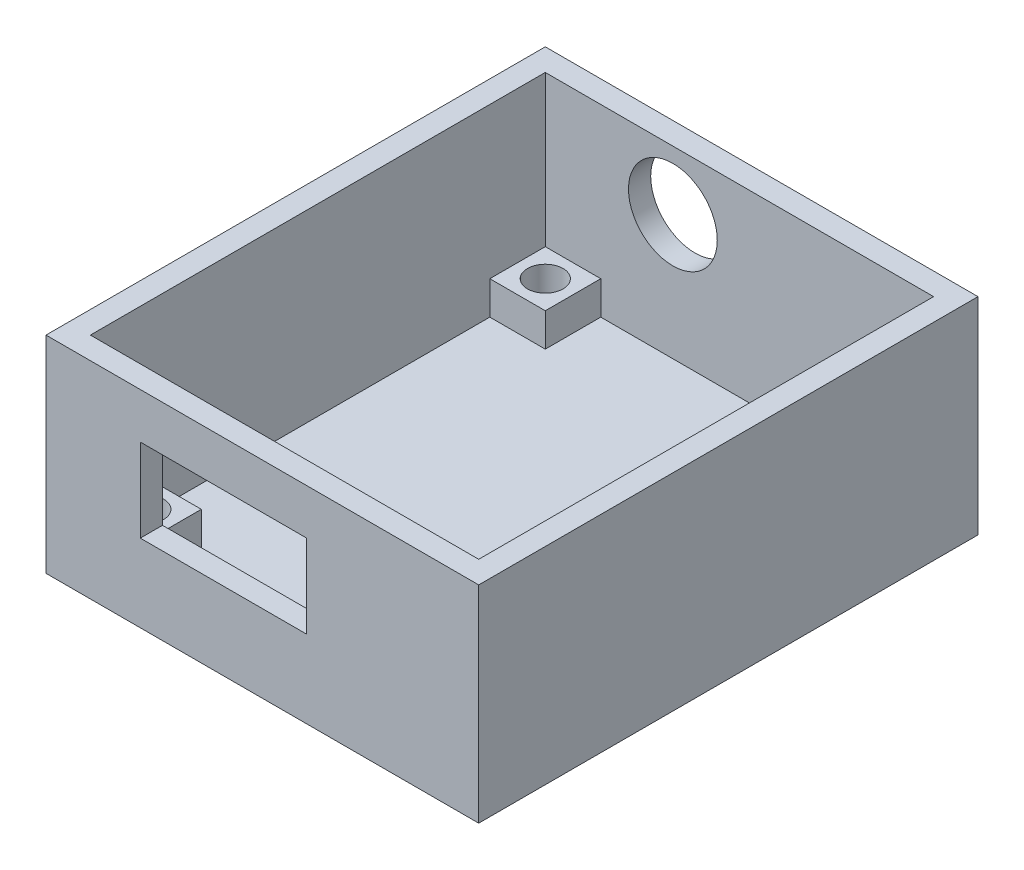
ISO-10303-21;
HEADER;
FILE_DESCRIPTION(('STEP AP214'),'2;1');
FILE_NAME('part.step','',(''),(''),'','','');
FILE_SCHEMA(('AUTOMOTIVE_DESIGN { 1 0 10303 214 1 1 1 1 }'));
ENDSEC;
DATA;
#1=APPLICATION_CONTEXT('core data for automotive mechanical design processes');
#2=APPLICATION_PROTOCOL_DEFINITION('international standard','automotive_design',2000,#1);
#3=PRODUCT_CONTEXT('',#1,'mechanical');
#4=PRODUCT('Part','Part','',(#3));
#5=PRODUCT_RELATED_PRODUCT_CATEGORY('part','',(#4));
#6=PRODUCT_DEFINITION_FORMATION('','',#4);
#7=PRODUCT_DEFINITION_CONTEXT('part definition',#1,'design');
#8=PRODUCT_DEFINITION('design','',#6,#7);
#9=PRODUCT_DEFINITION_SHAPE('','',#8);
#10=(LENGTH_UNIT() NAMED_UNIT(*) SI_UNIT(.MILLI.,.METRE.));
#11=(NAMED_UNIT(*) PLANE_ANGLE_UNIT() SI_UNIT($,.RADIAN.));
#12=(NAMED_UNIT(*) SI_UNIT($,.STERADIAN.) SOLID_ANGLE_UNIT());
#13=UNCERTAINTY_MEASURE_WITH_UNIT(LENGTH_MEASURE(1.E-05),#10,'distance_accuracy_value','');
#14=(GEOMETRIC_REPRESENTATION_CONTEXT(3) GLOBAL_UNCERTAINTY_ASSIGNED_CONTEXT((#13)) GLOBAL_UNIT_ASSIGNED_CONTEXT((#10,
#11,#12)) REPRESENTATION_CONTEXT('',''));
#15=CARTESIAN_POINT('',(0.,0.,0.));
#16=DIRECTION('',(0.,0.,1.));
#17=DIRECTION('',(1.,0.,0.));
#18=AXIS2_PLACEMENT_3D('',#15,#16,#17);
#19=CARTESIAN_POINT('',(0.,2.,0.));
#20=DIRECTION('',(0.,1.,0.));
#21=DIRECTION('',(0.,0.,1.));
#22=AXIS2_PLACEMENT_3D('',#19,#20,#21);
#23=PLANE('',#22);
#24=DIRECTION('',(-1.,0.,0.));
#25=VECTOR('',#24,1.);
#26=CARTESIAN_POINT('',(-17.5,2.,15.5));
#27=LINE('',#26,#25);
#28=CARTESIAN_POINT('',(-12.5,2.,15.5));
#29=VERTEX_POINT('',#28);
#30=CARTESIAN_POINT('',(-17.5,2.,15.5));
#31=VERTEX_POINT('',#30);
#32=EDGE_CURVE('E259',#29,#31,#27,.T.);
#33=ORIENTED_EDGE('',*,*,#32,.F.);
#34=DIRECTION('',(0.,0.,-1.));
#35=VECTOR('',#34,1.);
#36=CARTESIAN_POINT('',(-12.5,2.,20.5));
#37=LINE('',#36,#35);
#38=CARTESIAN_POINT('',(-12.5,2.,20.5));
#39=VERTEX_POINT('',#38);
#40=EDGE_CURVE('E252',#39,#29,#37,.T.);
#41=ORIENTED_EDGE('',*,*,#40,.F.);
#42=DIRECTION('',(1.,0.,0.));
#43=VECTOR('',#42,1.);
#44=CARTESIAN_POINT('',(19.5,2.,20.5));
#45=LINE('',#44,#43);
#46=CARTESIAN_POINT('',(12.4999999999999,2.,20.5));
#47=VERTEX_POINT('',#46);
#48=EDGE_CURVE('E356',#39,#47,#45,.T.);
#49=ORIENTED_EDGE('',*,*,#48,.T.);
#50=DIRECTION('',(0.,0.,1.));
#51=VECTOR('',#50,1.);
#52=CARTESIAN_POINT('',(12.4999999999999,2.,20.5));
#53=LINE('',#52,#51);
#54=CARTESIAN_POINT('',(12.4999999999999,2.,15.5));
#55=VERTEX_POINT('',#54);
#56=EDGE_CURVE('E284',#55,#47,#53,.T.);
#57=ORIENTED_EDGE('',*,*,#56,.F.);
#58=DIRECTION('',(-1.,0.,0.));
#59=VECTOR('',#58,1.);
#60=CARTESIAN_POINT('',(17.4999999999999,2.,15.5));
#61=LINE('',#60,#59);
#62=CARTESIAN_POINT('',(17.5,2.,15.5));
#63=VERTEX_POINT('',#62);
#64=EDGE_CURVE('E279',#63,#55,#61,.T.);
#65=ORIENTED_EDGE('',*,*,#64,.F.);
#66=DIRECTION('',(0.,0.,-1.));
#67=VECTOR('',#66,1.);
#68=CARTESIAN_POINT('',(17.5,2.,22.5));
#69=LINE('',#68,#67);
#70=CARTESIAN_POINT('',(17.5,2.,-15.5));
#71=VERTEX_POINT('',#70);
#72=EDGE_CURVE('E367',#63,#71,#69,.T.);
#73=ORIENTED_EDGE('',*,*,#72,.T.);
#74=DIRECTION('',(1.,0.,0.));
#75=VECTOR('',#74,1.);
#76=CARTESIAN_POINT('',(17.4999999999999,2.,-15.5));
#77=LINE('',#76,#75);
#78=CARTESIAN_POINT('',(12.4999999999999,2.,-15.5));
#79=VERTEX_POINT('',#78);
#80=EDGE_CURVE('E310',#79,#71,#77,.T.);
#81=ORIENTED_EDGE('',*,*,#80,.F.);
#82=DIRECTION('',(0.,0.,1.));
#83=VECTOR('',#82,1.);
#84=CARTESIAN_POINT('',(12.4999999999999,2.,-20.5));
#85=LINE('',#84,#83);
#86=CARTESIAN_POINT('',(12.4999999999999,2.,-20.5));
#87=VERTEX_POINT('',#86);
#88=EDGE_CURVE('E305',#87,#79,#85,.T.);
#89=ORIENTED_EDGE('',*,*,#88,.F.);
#90=DIRECTION('',(-1.,0.,0.));
#91=VECTOR('',#90,1.);
#92=CARTESIAN_POINT('',(19.5,2.,-20.5));
#93=LINE('',#92,#91);
#94=CARTESIAN_POINT('',(-12.5,2.,-20.5));
#95=VERTEX_POINT('',#94);
#96=EDGE_CURVE('E370',#87,#95,#93,.T.);
#97=ORIENTED_EDGE('',*,*,#96,.T.);
#98=DIRECTION('',(0.,0.,-1.));
#99=VECTOR('',#98,1.);
#100=CARTESIAN_POINT('',(-12.5,2.,-20.5));
#101=LINE('',#100,#99);
#102=CARTESIAN_POINT('',(-12.5,2.,-15.5));
#103=VERTEX_POINT('',#102);
#104=EDGE_CURVE('E336',#103,#95,#101,.T.);
#105=ORIENTED_EDGE('',*,*,#104,.F.);
#106=DIRECTION('',(1.,0.,0.));
#107=VECTOR('',#106,1.);
#108=CARTESIAN_POINT('',(-17.5,2.,-15.5));
#109=LINE('',#108,#107);
#110=CARTESIAN_POINT('',(-17.5,2.,-15.5));
#111=VERTEX_POINT('',#110);
#112=EDGE_CURVE('E331',#111,#103,#109,.T.);
#113=ORIENTED_EDGE('',*,*,#112,.F.);
#114=DIRECTION('',(0.,0.,1.));
#115=VECTOR('',#114,1.);
#116=CARTESIAN_POINT('',(-17.5,2.,22.5));
#117=LINE('',#116,#115);
#118=EDGE_CURVE('E353',#111,#31,#117,.T.);
#119=ORIENTED_EDGE('',*,*,#118,.T.);
#120=EDGE_LOOP('',(#33,#41,#49,#57,#65,#73,#81,#89,#97,#105,#113,#119));
#121=FACE_BOUND('',#120,.T.);
#122=ADVANCED_FACE('F32',(#121),#23,.T.);
#123=CARTESIAN_POINT('',(19.5,18.6,20.5));
#124=DIRECTION('',(0.,0.,-1.));
#125=DIRECTION('',(-1.,0.,0.));
#126=AXIS2_PLACEMENT_3D('',#123,#124,#125);
#127=PLANE('',#126);
#128=DIRECTION('',(0.,1.,0.));
#129=VECTOR('',#128,1.);
#130=CARTESIAN_POINT('',(4.,14.5,20.5));
#131=LINE('',#130,#129);
#132=CARTESIAN_POINT('',(4.00000000000001,7.,20.5));
#133=VERTEX_POINT('',#132);
#134=CARTESIAN_POINT('',(4.,14.5,20.5));
#135=VERTEX_POINT('',#134);
#136=EDGE_CURVE('E196',#133,#135,#131,.T.);
#137=ORIENTED_EDGE('',*,*,#136,.T.);
#138=DIRECTION('',(-1.,0.,0.));
#139=VECTOR('',#138,1.);
#140=CARTESIAN_POINT('',(-11.,14.5,20.5));
#141=LINE('',#140,#139);
#142=CARTESIAN_POINT('',(-11.,14.5,20.5));
#143=VERTEX_POINT('',#142);
#144=EDGE_CURVE('E219',#135,#143,#141,.T.);
#145=ORIENTED_EDGE('',*,*,#144,.T.);
#146=DIRECTION('',(0.,-1.,0.));
#147=VECTOR('',#146,1.);
#148=CARTESIAN_POINT('',(-11.,14.5,20.5));
#149=LINE('',#148,#147);
#150=CARTESIAN_POINT('',(-11.,7.,20.5));
#151=VERTEX_POINT('',#150);
#152=EDGE_CURVE('E199',#143,#151,#149,.T.);
#153=ORIENTED_EDGE('',*,*,#152,.T.);
#154=DIRECTION('',(1.,0.,0.));
#155=VECTOR('',#154,1.);
#156=CARTESIAN_POINT('',(-11.,7.,20.5));
#157=LINE('',#156,#155);
#158=EDGE_CURVE('E200',#151,#133,#157,.T.);
#159=ORIENTED_EDGE('',*,*,#158,.T.);
#160=EDGE_LOOP('',(#137,#145,#153,#159));
#161=FACE_BOUND('',#160,.T.);
#162=ORIENTED_EDGE('',*,*,#48,.F.);
#163=DIRECTION('',(0.,-1.,0.));
#164=VECTOR('',#163,1.);
#165=CARTESIAN_POINT('',(-12.5,5.,20.5));
#166=LINE('',#165,#164);
#167=CARTESIAN_POINT('',(-12.5,5.,20.5));
#168=VERTEX_POINT('',#167);
#169=EDGE_CURVE('E276',#168,#39,#166,.T.);
#170=ORIENTED_EDGE('',*,*,#169,.F.);
#171=DIRECTION('',(1.,0.,0.));
#172=VECTOR('',#171,1.);
#173=CARTESIAN_POINT('',(-17.5,5.,20.5));
#174=LINE('',#173,#172);
#175=CARTESIAN_POINT('',(-17.5,5.,20.5));
#176=VERTEX_POINT('',#175);
#177=EDGE_CURVE('E255',#176,#168,#174,.T.);
#178=ORIENTED_EDGE('',*,*,#177,.F.);
#179=DIRECTION('',(0.,-1.,0.));
#180=VECTOR('',#179,1.);
#181=CARTESIAN_POINT('',(-17.5,18.6,20.5));
#182=LINE('',#181,#180);
#183=CARTESIAN_POINT('',(-17.5,18.6,20.5));
#184=VERTEX_POINT('',#183);
#185=EDGE_CURVE('E357',#184,#176,#182,.T.);
#186=ORIENTED_EDGE('',*,*,#185,.F.);
#187=DIRECTION('',(1.,0.,0.));
#188=VECTOR('',#187,1.);
#189=CARTESIAN_POINT('',(19.5,18.6,20.5));
#190=LINE('',#189,#188);
#191=CARTESIAN_POINT('',(17.5,18.6,20.5));
#192=VERTEX_POINT('',#191);
#193=EDGE_CURVE('E375',#184,#192,#190,.T.);
#194=ORIENTED_EDGE('',*,*,#193,.T.);
#195=DIRECTION('',(0.,-1.,0.));
#196=VECTOR('',#195,1.);
#197=CARTESIAN_POINT('',(17.5,18.6,20.5));
#198=LINE('',#197,#196);
#199=CARTESIAN_POINT('',(17.4999999999999,5.,20.5));
#200=VERTEX_POINT('',#199);
#201=EDGE_CURVE('E360',#192,#200,#198,.T.);
#202=ORIENTED_EDGE('',*,*,#201,.T.);
#203=DIRECTION('',(1.,0.,0.));
#204=VECTOR('',#203,1.);
#205=CARTESIAN_POINT('',(17.4999999999999,5.,20.5));
#206=LINE('',#205,#204);
#207=CARTESIAN_POINT('',(12.4999999999999,5.,20.5));
#208=VERTEX_POINT('',#207);
#209=EDGE_CURVE('E289',#208,#200,#206,.T.);
#210=ORIENTED_EDGE('',*,*,#209,.F.);
#211=DIRECTION('',(0.,-1.,0.));
#212=VECTOR('',#211,1.);
#213=CARTESIAN_POINT('',(12.4999999999999,5.,20.5));
#214=LINE('',#213,#212);
#215=EDGE_CURVE('E292',#208,#47,#214,.T.);
#216=ORIENTED_EDGE('',*,*,#215,.T.);
#217=EDGE_LOOP('',(#162,#170,#178,#186,#194,#202,#210,#216));
#218=FACE_BOUND('',#217,.T.);
#219=ADVANCED_FACE('F431',(#161,#218),#127,.T.);
#220=CARTESIAN_POINT('',(-17.5,18.6,22.5));
#221=DIRECTION('',(1.,0.,0.));
#222=DIRECTION('',(0.,0.,-1.));
#223=AXIS2_PLACEMENT_3D('',#220,#221,#222);
#224=PLANE('',#223);
#225=DIRECTION('',(0.,0.,1.));
#226=VECTOR('',#225,1.);
#227=CARTESIAN_POINT('',(-17.5,5.,20.5));
#228=LINE('',#227,#226);
#229=CARTESIAN_POINT('',(-17.5,5.,15.5));
#230=VERTEX_POINT('',#229);
#231=EDGE_CURVE('E264',#230,#176,#228,.T.);
#232=ORIENTED_EDGE('',*,*,#231,.F.);
#233=DIRECTION('',(0.,-1.,0.));
#234=VECTOR('',#233,1.);
#235=CARTESIAN_POINT('',(-17.5,5.,15.5));
#236=LINE('',#235,#234);
#237=EDGE_CURVE('E267',#230,#31,#236,.T.);
#238=ORIENTED_EDGE('',*,*,#237,.T.);
#239=ORIENTED_EDGE('',*,*,#118,.F.);
#240=DIRECTION('',(0.,-1.,0.));
#241=VECTOR('',#240,1.);
#242=CARTESIAN_POINT('',(-17.5,5.,-15.5));
#243=LINE('',#242,#241);
#244=CARTESIAN_POINT('',(-17.5,5.,-15.5));
#245=VERTEX_POINT('',#244);
#246=EDGE_CURVE('E351',#245,#111,#243,.T.);
#247=ORIENTED_EDGE('',*,*,#246,.F.);
#248=DIRECTION('',(0.,0.,1.));
#249=VECTOR('',#248,1.);
#250=CARTESIAN_POINT('',(-17.5,5.,-20.5));
#251=LINE('',#250,#249);
#252=CARTESIAN_POINT('',(-17.5,5.,-20.5));
#253=VERTEX_POINT('',#252);
#254=EDGE_CURVE('E332',#253,#245,#251,.T.);
#255=ORIENTED_EDGE('',*,*,#254,.F.);
#256=DIRECTION('',(0.,-1.,0.));
#257=VECTOR('',#256,1.);
#258=CARTESIAN_POINT('',(-17.5,18.6,-20.5));
#259=LINE('',#258,#257);
#260=CARTESIAN_POINT('',(-17.5,18.6,-20.5));
#261=VERTEX_POINT('',#260);
#262=EDGE_CURVE('E361',#261,#253,#259,.T.);
#263=ORIENTED_EDGE('',*,*,#262,.F.);
#264=DIRECTION('',(0.,0.,1.));
#265=VECTOR('',#264,1.);
#266=CARTESIAN_POINT('',(-17.5,18.6,22.5));
#267=LINE('',#266,#265);
#268=EDGE_CURVE('E373',#261,#184,#267,.T.);
#269=ORIENTED_EDGE('',*,*,#268,.T.);
#270=ORIENTED_EDGE('',*,*,#185,.T.);
#271=EDGE_LOOP('',(#232,#238,#239,#247,#255,#263,#269,#270));
#272=FACE_BOUND('',#271,.T.);
#273=ADVANCED_FACE('F437',(#272),#224,.T.);
#274=CARTESIAN_POINT('',(17.5,18.6,22.5));
#275=DIRECTION('',(-1.,0.,0.));
#276=DIRECTION('',(0.,0.,1.));
#277=AXIS2_PLACEMENT_3D('',#274,#275,#276);
#278=PLANE('',#277);
#279=ORIENTED_EDGE('',*,*,#72,.F.);
#280=DIRECTION('',(0.,-1.,0.));
#281=VECTOR('',#280,1.);
#282=CARTESIAN_POINT('',(17.4999999999999,5.,15.5));
#283=LINE('',#282,#281);
#284=CARTESIAN_POINT('',(17.5,5.,15.5));
#285=VERTEX_POINT('',#284);
#286=EDGE_CURVE('E302',#285,#63,#283,.T.);
#287=ORIENTED_EDGE('',*,*,#286,.F.);
#288=DIRECTION('',(0.,0.,-1.));
#289=VECTOR('',#288,1.);
#290=CARTESIAN_POINT('',(17.4999999999999,5.,20.5));
#291=LINE('',#290,#289);
#292=EDGE_CURVE('E280',#200,#285,#291,.T.);
#293=ORIENTED_EDGE('',*,*,#292,.F.);
#294=ORIENTED_EDGE('',*,*,#201,.F.);
#295=DIRECTION('',(0.,0.,-1.));
#296=VECTOR('',#295,1.);
#297=CARTESIAN_POINT('',(17.5,18.6,22.5));
#298=LINE('',#297,#296);
#299=CARTESIAN_POINT('',(17.5,18.6,-20.5));
#300=VERTEX_POINT('',#299);
#301=EDGE_CURVE('E377',#192,#300,#298,.T.);
#302=ORIENTED_EDGE('',*,*,#301,.T.);
#303=DIRECTION('',(0.,-1.,0.));
#304=VECTOR('',#303,1.);
#305=CARTESIAN_POINT('',(17.5,18.6,-20.5));
#306=LINE('',#305,#304);
#307=CARTESIAN_POINT('',(17.4999999999999,5.,-20.5));
#308=VERTEX_POINT('',#307);
#309=EDGE_CURVE('E364',#300,#308,#306,.T.);
#310=ORIENTED_EDGE('',*,*,#309,.T.);
#311=DIRECTION('',(0.,0.,-1.));
#312=VECTOR('',#311,1.);
#313=CARTESIAN_POINT('',(17.4999999999999,5.,-20.5));
#314=LINE('',#313,#312);
#315=CARTESIAN_POINT('',(17.5,5.,-15.5));
#316=VERTEX_POINT('',#315);
#317=EDGE_CURVE('E315',#316,#308,#314,.T.);
#318=ORIENTED_EDGE('',*,*,#317,.F.);
#319=DIRECTION('',(0.,-1.,0.));
#320=VECTOR('',#319,1.);
#321=CARTESIAN_POINT('',(17.4999999999999,5.,-15.5));
#322=LINE('',#321,#320);
#323=EDGE_CURVE('E318',#316,#71,#322,.T.);
#324=ORIENTED_EDGE('',*,*,#323,.T.);
#325=EDGE_LOOP('',(#279,#287,#293,#294,#302,#310,#318,#324));
#326=FACE_BOUND('',#325,.T.);
#327=ADVANCED_FACE('F485',(#326),#278,.T.);
#328=CARTESIAN_POINT('',(19.5,18.6,-20.5));
#329=DIRECTION('',(0.,0.,1.));
#330=DIRECTION('',(1.,0.,0.));
#331=AXIS2_PLACEMENT_3D('',#328,#329,#330);
#332=PLANE('',#331);
#333=CARTESIAN_POINT('',(-6.,13.25,-20.5));
#334=DIRECTION('',(0.,0.,1.));
#335=DIRECTION('',(1.,0.,0.));
#336=AXIS2_PLACEMENT_3D('',#333,#334,#335);
#337=CIRCLE('',#336,4.);
#338=CARTESIAN_POINT('',(-2.,13.25,-20.5));
#339=VERTEX_POINT('',#338);
#340=EDGE_CURVE('E456',#339,#339,#337,.F.);
#341=ORIENTED_EDGE('',*,*,#340,.T.);
#342=EDGE_LOOP('',(#341));
#343=FACE_BOUND('',#342,.T.);
#344=ORIENTED_EDGE('',*,*,#96,.F.);
#345=DIRECTION('',(0.,-1.,0.));
#346=VECTOR('',#345,1.);
#347=CARTESIAN_POINT('',(12.4999999999999,5.,-20.5));
#348=LINE('',#347,#346);
#349=CARTESIAN_POINT('',(12.4999999999999,5.,-20.5));
#350=VERTEX_POINT('',#349);
#351=EDGE_CURVE('E328',#350,#87,#348,.T.);
#352=ORIENTED_EDGE('',*,*,#351,.F.);
#353=DIRECTION('',(-1.,0.,0.));
#354=VECTOR('',#353,1.);
#355=CARTESIAN_POINT('',(17.4999999999999,5.,-20.5));
#356=LINE('',#355,#354);
#357=EDGE_CURVE('E306',#308,#350,#356,.T.);
#358=ORIENTED_EDGE('',*,*,#357,.F.);
#359=ORIENTED_EDGE('',*,*,#309,.F.);
#360=DIRECTION('',(-1.,0.,0.));
#361=VECTOR('',#360,1.);
#362=CARTESIAN_POINT('',(19.5,18.6,-20.5));
#363=LINE('',#362,#361);
#364=EDGE_CURVE('E365',#300,#261,#363,.T.);
#365=ORIENTED_EDGE('',*,*,#364,.T.);
#366=ORIENTED_EDGE('',*,*,#262,.T.);
#367=DIRECTION('',(-1.,0.,0.));
#368=VECTOR('',#367,1.);
#369=CARTESIAN_POINT('',(-17.5,5.,-20.5));
#370=LINE('',#369,#368);
#371=CARTESIAN_POINT('',(-12.5,5.,-20.5));
#372=VERTEX_POINT('',#371);
#373=EDGE_CURVE('E340',#372,#253,#370,.T.);
#374=ORIENTED_EDGE('',*,*,#373,.F.);
#375=DIRECTION('',(0.,-1.,0.));
#376=VECTOR('',#375,1.);
#377=CARTESIAN_POINT('',(-12.5,5.,-20.5));
#378=LINE('',#377,#376);
#379=EDGE_CURVE('E342',#372,#95,#378,.T.);
#380=ORIENTED_EDGE('',*,*,#379,.T.);
#381=EDGE_LOOP('',(#344,#352,#358,#359,#365,#366,#374,#380));
#382=FACE_BOUND('',#381,.T.);
#383=ADVANCED_FACE('F429',(#343,#382),#332,.T.);
#384=CARTESIAN_POINT('',(-19.5,18.6,22.5));
#385=DIRECTION('',(1.,0.,0.));
#386=DIRECTION('',(0.,0.,-1.));
#387=AXIS2_PLACEMENT_3D('',#384,#385,#386);
#388=PLANE('',#387);
#389=DIRECTION('',(0.,0.,1.));
#390=VECTOR('',#389,1.);
#391=CARTESIAN_POINT('',(-19.5,0.,22.5));
#392=LINE('',#391,#390);
#393=CARTESIAN_POINT('',(-19.5,0.,-22.5));
#394=VERTEX_POINT('',#393);
#395=CARTESIAN_POINT('',(-19.5,0.,22.5));
#396=VERTEX_POINT('',#395);
#397=EDGE_CURVE('E359',#394,#396,#392,.T.);
#398=ORIENTED_EDGE('',*,*,#397,.T.);
#399=DIRECTION('',(0.,-1.,0.));
#400=VECTOR('',#399,1.);
#401=CARTESIAN_POINT('',(-19.5,18.6,22.5));
#402=LINE('',#401,#400);
#403=CARTESIAN_POINT('',(-19.5,18.6,22.5));
#404=VERTEX_POINT('',#403);
#405=EDGE_CURVE('E11',#404,#396,#402,.T.);
#406=ORIENTED_EDGE('',*,*,#405,.F.);
#407=DIRECTION('',(0.,0.,1.));
#408=VECTOR('',#407,1.);
#409=CARTESIAN_POINT('',(-19.5,18.6,22.5));
#410=LINE('',#409,#408);
#411=CARTESIAN_POINT('',(-19.5,18.6,-22.5));
#412=VERTEX_POINT('',#411);
#413=EDGE_CURVE('E381',#412,#404,#410,.T.);
#414=ORIENTED_EDGE('',*,*,#413,.F.);
#415=DIRECTION('',(0.,-1.,0.));
#416=VECTOR('',#415,1.);
#417=CARTESIAN_POINT('',(-19.5,18.6,-22.5));
#418=LINE('',#417,#416);
#419=EDGE_CURVE('E391',#412,#394,#418,.T.);
#420=ORIENTED_EDGE('',*,*,#419,.T.);
#421=EDGE_LOOP('',(#398,#406,#414,#420));
#422=FACE_BOUND('',#421,.T.);
#423=ADVANCED_FACE('F34',(#422),#388,.F.);
#424=CARTESIAN_POINT('',(19.5,18.6,22.5));
#425=DIRECTION('',(0.,0.,-1.));
#426=DIRECTION('',(-1.,0.,0.));
#427=AXIS2_PLACEMENT_3D('',#424,#425,#426);
#428=PLANE('',#427);
#429=DIRECTION('',(-1.,0.,0.));
#430=VECTOR('',#429,1.);
#431=CARTESIAN_POINT('',(-11.,14.5,22.5));
#432=LINE('',#431,#430);
#433=CARTESIAN_POINT('',(4.,14.5,22.5));
#434=VERTEX_POINT('',#433);
#435=CARTESIAN_POINT('',(-11.,14.5,22.5));
#436=VERTEX_POINT('',#435);
#437=EDGE_CURVE('E216',#434,#436,#432,.T.);
#438=ORIENTED_EDGE('',*,*,#437,.F.);
#439=DIRECTION('',(0.,1.,0.));
#440=VECTOR('',#439,1.);
#441=CARTESIAN_POINT('',(4.,14.5,22.5));
#442=LINE('',#441,#440);
#443=CARTESIAN_POINT('',(4.00000000000001,7.,22.5));
#444=VERTEX_POINT('',#443);
#445=EDGE_CURVE('E55',#444,#434,#442,.T.);
#446=ORIENTED_EDGE('',*,*,#445,.F.);
#447=DIRECTION('',(1.,0.,0.));
#448=VECTOR('',#447,1.);
#449=CARTESIAN_POINT('',(-11.,7.,22.5));
#450=LINE('',#449,#448);
#451=CARTESIAN_POINT('',(-11.,7.,22.5));
#452=VERTEX_POINT('',#451);
#453=EDGE_CURVE('E203',#452,#444,#450,.T.);
#454=ORIENTED_EDGE('',*,*,#453,.F.);
#455=DIRECTION('',(0.,-1.,0.));
#456=VECTOR('',#455,1.);
#457=CARTESIAN_POINT('',(-11.,14.5,22.5));
#458=LINE('',#457,#456);
#459=EDGE_CURVE('E211',#436,#452,#458,.T.);
#460=ORIENTED_EDGE('',*,*,#459,.F.);
#461=EDGE_LOOP('',(#438,#446,#454,#460));
#462=FACE_BOUND('',#461,.T.);
#463=DIRECTION('',(1.,0.,0.));
#464=VECTOR('',#463,1.);
#465=CARTESIAN_POINT('',(19.5,0.,22.5));
#466=LINE('',#465,#464);
#467=CARTESIAN_POINT('',(19.5,0.,22.5));
#468=VERTEX_POINT('',#467);
#469=EDGE_CURVE('E394',#396,#468,#466,.T.);
#470=ORIENTED_EDGE('',*,*,#469,.T.);
#471=DIRECTION('',(0.,-1.,0.));
#472=VECTOR('',#471,1.);
#473=CARTESIAN_POINT('',(19.5,18.6,22.5));
#474=LINE('',#473,#472);
#475=CARTESIAN_POINT('',(19.5,18.6,22.5));
#476=VERTEX_POINT('',#475);
#477=EDGE_CURVE('E40',#476,#468,#474,.T.);
#478=ORIENTED_EDGE('',*,*,#477,.F.);
#479=DIRECTION('',(1.,0.,0.));
#480=VECTOR('',#479,1.);
#481=CARTESIAN_POINT('',(19.5,18.6,22.5));
#482=LINE('',#481,#480);
#483=EDGE_CURVE('E384',#404,#476,#482,.T.);
#484=ORIENTED_EDGE('',*,*,#483,.F.);
#485=ORIENTED_EDGE('',*,*,#405,.T.);
#486=EDGE_LOOP('',(#470,#478,#484,#485));
#487=FACE_BOUND('',#486,.T.);
#488=ADVANCED_FACE('F214',(#462,#487),#428,.F.);
#489=CARTESIAN_POINT('',(19.5,18.6,22.5));
#490=DIRECTION('',(-1.,0.,0.));
#491=DIRECTION('',(0.,0.,1.));
#492=AXIS2_PLACEMENT_3D('',#489,#490,#491);
#493=PLANE('',#492);
#494=DIRECTION('',(0.,0.,-1.));
#495=VECTOR('',#494,1.);
#496=CARTESIAN_POINT('',(19.5,0.,22.5));
#497=LINE('',#496,#495);
#498=CARTESIAN_POINT('',(19.5,0.,-22.5));
#499=VERTEX_POINT('',#498);
#500=EDGE_CURVE('E396',#468,#499,#497,.T.);
#501=ORIENTED_EDGE('',*,*,#500,.T.);
#502=DIRECTION('',(0.,-1.,0.));
#503=VECTOR('',#502,1.);
#504=CARTESIAN_POINT('',(19.5,18.6,-22.5));
#505=LINE('',#504,#503);
#506=CARTESIAN_POINT('',(19.5,18.6,-22.5));
#507=VERTEX_POINT('',#506);
#508=EDGE_CURVE('E401',#507,#499,#505,.T.);
#509=ORIENTED_EDGE('',*,*,#508,.F.);
#510=DIRECTION('',(0.,0.,-1.));
#511=VECTOR('',#510,1.);
#512=CARTESIAN_POINT('',(19.5,18.6,22.5));
#513=LINE('',#512,#511);
#514=EDGE_CURVE('E387',#476,#507,#513,.T.);
#515=ORIENTED_EDGE('',*,*,#514,.F.);
#516=ORIENTED_EDGE('',*,*,#477,.T.);
#517=EDGE_LOOP('',(#501,#509,#515,#516));
#518=FACE_BOUND('',#517,.T.);
#519=ADVANCED_FACE('F408',(#518),#493,.F.);
#520=CARTESIAN_POINT('',(19.5,18.6,-22.5));
#521=DIRECTION('',(0.,0.,1.));
#522=DIRECTION('',(1.,0.,0.));
#523=AXIS2_PLACEMENT_3D('',#520,#521,#522);
#524=PLANE('',#523);
#525=CARTESIAN_POINT('',(-6.,13.25,-22.5));
#526=DIRECTION('',(0.,0.,-1.));
#527=DIRECTION('',(-1.,0.,0.));
#528=AXIS2_PLACEMENT_3D('',#525,#526,#527);
#529=CIRCLE('',#528,4.);
#530=CARTESIAN_POINT('',(-10.,13.25,-22.5));
#531=VERTEX_POINT('',#530);
#532=EDGE_CURVE('E225',#531,#531,#529,.T.);
#533=ORIENTED_EDGE('',*,*,#532,.F.);
#534=EDGE_LOOP('',(#533));
#535=FACE_BOUND('',#534,.T.);
#536=DIRECTION('',(-1.,0.,0.));
#537=VECTOR('',#536,1.);
#538=CARTESIAN_POINT('',(19.5,0.,-22.5));
#539=LINE('',#538,#537);
#540=EDGE_CURVE('E385',#499,#394,#539,.T.);
#541=ORIENTED_EDGE('',*,*,#540,.T.);
#542=ORIENTED_EDGE('',*,*,#419,.F.);
#543=DIRECTION('',(-1.,0.,0.));
#544=VECTOR('',#543,1.);
#545=CARTESIAN_POINT('',(19.5,18.6,-22.5));
#546=LINE('',#545,#544);
#547=EDGE_CURVE('E389',#507,#412,#546,.T.);
#548=ORIENTED_EDGE('',*,*,#547,.F.);
#549=ORIENTED_EDGE('',*,*,#508,.T.);
#550=EDGE_LOOP('',(#541,#542,#548,#549));
#551=FACE_BOUND('',#550,.T.);
#552=ADVANCED_FACE('F416',(#535,#551),#524,.F.);
#553=CARTESIAN_POINT('',(0.,18.6,0.));
#554=DIRECTION('',(0.,1.,0.));
#555=DIRECTION('',(0.,0.,1.));
#556=AXIS2_PLACEMENT_3D('',#553,#554,#555);
#557=PLANE('',#556);
#558=ORIENTED_EDGE('',*,*,#268,.F.);
#559=ORIENTED_EDGE('',*,*,#364,.F.);
#560=ORIENTED_EDGE('',*,*,#301,.F.);
#561=ORIENTED_EDGE('',*,*,#193,.F.);
#562=EDGE_LOOP('',(#558,#559,#560,#561));
#563=FACE_BOUND('',#562,.T.);
#564=ORIENTED_EDGE('',*,*,#413,.T.);
#565=ORIENTED_EDGE('',*,*,#483,.T.);
#566=ORIENTED_EDGE('',*,*,#514,.T.);
#567=ORIENTED_EDGE('',*,*,#547,.T.);
#568=EDGE_LOOP('',(#564,#565,#566,#567));
#569=FACE_BOUND('',#568,.T.);
#570=ADVANCED_FACE('F422',(#563,#569),#557,.T.);
#571=CARTESIAN_POINT('',(0.,0.,0.));
#572=DIRECTION('',(0.,1.,0.));
#573=DIRECTION('',(0.,0.,1.));
#574=AXIS2_PLACEMENT_3D('',#571,#572,#573);
#575=PLANE('',#574);
#576=ORIENTED_EDGE('',*,*,#397,.F.);
#577=ORIENTED_EDGE('',*,*,#540,.F.);
#578=ORIENTED_EDGE('',*,*,#500,.F.);
#579=ORIENTED_EDGE('',*,*,#469,.F.);
#580=EDGE_LOOP('',(#576,#577,#578,#579));
#581=FACE_BOUND('',#580,.T.);
#582=ADVANCED_FACE('F413',(#581),#575,.F.);
#583=CARTESIAN_POINT('',(-17.5,5.,-15.5));
#584=DIRECTION('',(0.,0.,-1.));
#585=DIRECTION('',(-1.,0.,0.));
#586=AXIS2_PLACEMENT_3D('',#583,#584,#585);
#587=PLANE('',#586);
#588=ORIENTED_EDGE('',*,*,#112,.T.);
#589=DIRECTION('',(0.,-1.,0.));
#590=VECTOR('',#589,1.);
#591=CARTESIAN_POINT('',(-12.5,5.,-15.5));
#592=LINE('',#591,#590);
#593=CARTESIAN_POINT('',(-12.5,5.,-15.5));
#594=VERTEX_POINT('',#593);
#595=EDGE_CURVE('E349',#594,#103,#592,.T.);
#596=ORIENTED_EDGE('',*,*,#595,.F.);
#597=DIRECTION('',(1.,0.,0.));
#598=VECTOR('',#597,1.);
#599=CARTESIAN_POINT('',(-17.5,5.,-15.5));
#600=LINE('',#599,#598);
#601=EDGE_CURVE('E335',#245,#594,#600,.T.);
#602=ORIENTED_EDGE('',*,*,#601,.F.);
#603=ORIENTED_EDGE('',*,*,#246,.T.);
#604=EDGE_LOOP('',(#588,#596,#602,#603));
#605=FACE_BOUND('',#604,.T.);
#606=ADVANCED_FACE('F448',(#605),#587,.F.);
#607=CARTESIAN_POINT('',(-12.5,5.,-20.5));
#608=DIRECTION('',(-1.,0.,0.));
#609=DIRECTION('',(0.,0.,1.));
#610=AXIS2_PLACEMENT_3D('',#607,#608,#609);
#611=PLANE('',#610);
#612=ORIENTED_EDGE('',*,*,#104,.T.);
#613=ORIENTED_EDGE('',*,*,#379,.F.);
#614=DIRECTION('',(0.,0.,-1.));
#615=VECTOR('',#614,1.);
#616=CARTESIAN_POINT('',(-12.5,5.,-20.5));
#617=LINE('',#616,#615);
#618=EDGE_CURVE('E338',#594,#372,#617,.T.);
#619=ORIENTED_EDGE('',*,*,#618,.F.);
#620=ORIENTED_EDGE('',*,*,#595,.T.);
#621=EDGE_LOOP('',(#612,#613,#619,#620));
#622=FACE_BOUND('',#621,.T.);
#623=ADVANCED_FACE('F514',(#622),#611,.F.);
#624=CARTESIAN_POINT('',(0.,5.,0.));
#625=DIRECTION('',(0.,1.,0.));
#626=DIRECTION('',(0.,0.,1.));
#627=AXIS2_PLACEMENT_3D('',#624,#625,#626);
#628=PLANE('',#627);
#629=CARTESIAN_POINT('',(-15.,5.,-18.));
#630=DIRECTION('',(0.,1.,0.));
#631=DIRECTION('',(0.,0.,1.));
#632=AXIS2_PLACEMENT_3D('',#629,#630,#631);
#633=CIRCLE('',#632,1.6);
#634=CARTESIAN_POINT('',(-15.,5.,-16.4));
#635=VERTEX_POINT('',#634);
#636=EDGE_CURVE('E234',#635,#635,#633,.T.);
#637=ORIENTED_EDGE('',*,*,#636,.F.);
#638=EDGE_LOOP('',(#637));
#639=FACE_BOUND('',#638,.T.);
#640=ORIENTED_EDGE('',*,*,#254,.T.);
#641=ORIENTED_EDGE('',*,*,#601,.T.);
#642=ORIENTED_EDGE('',*,*,#618,.T.);
#643=ORIENTED_EDGE('',*,*,#373,.T.);
#644=EDGE_LOOP('',(#640,#641,#642,#643));
#645=FACE_BOUND('',#644,.T.);
#646=ADVANCED_FACE('F550',(#639,#645),#628,.T.);
#647=CARTESIAN_POINT('',(12.4999999999999,5.,-20.5));
#648=DIRECTION('',(1.,0.,0.));
#649=DIRECTION('',(0.,0.,-1.));
#650=AXIS2_PLACEMENT_3D('',#647,#648,#649);
#651=PLANE('',#650);
#652=ORIENTED_EDGE('',*,*,#88,.T.);
#653=DIRECTION('',(0.,-1.,0.));
#654=VECTOR('',#653,1.);
#655=CARTESIAN_POINT('',(12.4999999999999,5.,-15.5));
#656=LINE('',#655,#654);
#657=CARTESIAN_POINT('',(12.4999999999999,5.,-15.5));
#658=VERTEX_POINT('',#657);
#659=EDGE_CURVE('E325',#658,#79,#656,.T.);
#660=ORIENTED_EDGE('',*,*,#659,.F.);
#661=DIRECTION('',(0.,0.,1.));
#662=VECTOR('',#661,1.);
#663=CARTESIAN_POINT('',(12.4999999999999,5.,-20.5));
#664=LINE('',#663,#662);
#665=EDGE_CURVE('E309',#350,#658,#664,.T.);
#666=ORIENTED_EDGE('',*,*,#665,.F.);
#667=ORIENTED_EDGE('',*,*,#351,.T.);
#668=EDGE_LOOP('',(#652,#660,#666,#667));
#669=FACE_BOUND('',#668,.T.);
#670=ADVANCED_FACE('F502',(#669),#651,.F.);
#671=CARTESIAN_POINT('',(17.4999999999999,5.,-15.5));
#672=DIRECTION('',(0.,0.,-1.));
#673=DIRECTION('',(-1.,0.,0.));
#674=AXIS2_PLACEMENT_3D('',#671,#672,#673);
#675=PLANE('',#674);
#676=ORIENTED_EDGE('',*,*,#80,.T.);
#677=ORIENTED_EDGE('',*,*,#323,.F.);
#678=DIRECTION('',(1.,0.,0.));
#679=VECTOR('',#678,1.);
#680=CARTESIAN_POINT('',(17.4999999999999,5.,-15.5));
#681=LINE('',#680,#679);
#682=EDGE_CURVE('E312',#658,#316,#681,.T.);
#683=ORIENTED_EDGE('',*,*,#682,.F.);
#684=ORIENTED_EDGE('',*,*,#659,.T.);
#685=EDGE_LOOP('',(#676,#677,#683,#684));
#686=FACE_BOUND('',#685,.T.);
#687=ADVANCED_FACE('F505',(#686),#675,.F.);
#688=CARTESIAN_POINT('',(0.,5.,0.));
#689=DIRECTION('',(0.,1.,0.));
#690=DIRECTION('',(0.,0.,1.));
#691=AXIS2_PLACEMENT_3D('',#688,#689,#690);
#692=PLANE('',#691);
#693=CARTESIAN_POINT('',(15.,5.,-18.));
#694=DIRECTION('',(0.,1.,0.));
#695=DIRECTION('',(0.,0.,1.));
#696=AXIS2_PLACEMENT_3D('',#693,#694,#695);
#697=CIRCLE('',#696,1.6);
#698=CARTESIAN_POINT('',(15.,5.,-16.4));
#699=VERTEX_POINT('',#698);
#700=EDGE_CURVE('E235',#699,#699,#697,.T.);
#701=ORIENTED_EDGE('',*,*,#700,.F.);
#702=EDGE_LOOP('',(#701));
#703=FACE_BOUND('',#702,.T.);
#704=ORIENTED_EDGE('',*,*,#357,.T.);
#705=ORIENTED_EDGE('',*,*,#665,.T.);
#706=ORIENTED_EDGE('',*,*,#682,.T.);
#707=ORIENTED_EDGE('',*,*,#317,.T.);
#708=EDGE_LOOP('',(#704,#705,#706,#707));
#709=FACE_BOUND('',#708,.T.);
#710=ADVANCED_FACE('F507',(#703,#709),#692,.T.);
#711=CARTESIAN_POINT('',(17.4999999999999,5.,15.5));
#712=DIRECTION('',(0.,0.,1.));
#713=DIRECTION('',(1.,0.,0.));
#714=AXIS2_PLACEMENT_3D('',#711,#712,#713);
#715=PLANE('',#714);
#716=ORIENTED_EDGE('',*,*,#64,.T.);
#717=DIRECTION('',(0.,-1.,0.));
#718=VECTOR('',#717,1.);
#719=CARTESIAN_POINT('',(12.4999999999999,5.,15.5));
#720=LINE('',#719,#718);
#721=CARTESIAN_POINT('',(12.4999999999999,5.,15.5));
#722=VERTEX_POINT('',#721);
#723=EDGE_CURVE('E299',#722,#55,#720,.T.);
#724=ORIENTED_EDGE('',*,*,#723,.F.);
#725=DIRECTION('',(-1.,0.,0.));
#726=VECTOR('',#725,1.);
#727=CARTESIAN_POINT('',(17.4999999999999,5.,15.5));
#728=LINE('',#727,#726);
#729=EDGE_CURVE('E283',#285,#722,#728,.T.);
#730=ORIENTED_EDGE('',*,*,#729,.F.);
#731=ORIENTED_EDGE('',*,*,#286,.T.);
#732=EDGE_LOOP('',(#716,#724,#730,#731));
#733=FACE_BOUND('',#732,.T.);
#734=ADVANCED_FACE('F496',(#733),#715,.F.);
#735=CARTESIAN_POINT('',(12.4999999999999,5.,20.5));
#736=DIRECTION('',(1.,0.,0.));
#737=DIRECTION('',(0.,0.,-1.));
#738=AXIS2_PLACEMENT_3D('',#735,#736,#737);
#739=PLANE('',#738);
#740=ORIENTED_EDGE('',*,*,#56,.T.);
#741=ORIENTED_EDGE('',*,*,#215,.F.);
#742=DIRECTION('',(0.,0.,1.));
#743=VECTOR('',#742,1.);
#744=CARTESIAN_POINT('',(12.4999999999999,5.,20.5));
#745=LINE('',#744,#743);
#746=EDGE_CURVE('E286',#722,#208,#745,.T.);
#747=ORIENTED_EDGE('',*,*,#746,.F.);
#748=ORIENTED_EDGE('',*,*,#723,.T.);
#749=EDGE_LOOP('',(#740,#741,#747,#748));
#750=FACE_BOUND('',#749,.T.);
#751=ADVANCED_FACE('F494',(#750),#739,.F.);
#752=CARTESIAN_POINT('',(0.,5.,0.));
#753=DIRECTION('',(0.,1.,0.));
#754=DIRECTION('',(0.,0.,1.));
#755=AXIS2_PLACEMENT_3D('',#752,#753,#754);
#756=PLANE('',#755);
#757=CARTESIAN_POINT('',(15.,5.,18.));
#758=DIRECTION('',(0.,1.,0.));
#759=DIRECTION('',(0.,0.,1.));
#760=AXIS2_PLACEMENT_3D('',#757,#758,#759);
#761=CIRCLE('',#760,1.6);
#762=CARTESIAN_POINT('',(15.,5.,19.6));
#763=VERTEX_POINT('',#762);
#764=EDGE_CURVE('E241',#763,#763,#761,.T.);
#765=ORIENTED_EDGE('',*,*,#764,.F.);
#766=EDGE_LOOP('',(#765));
#767=FACE_BOUND('',#766,.T.);
#768=ORIENTED_EDGE('',*,*,#292,.T.);
#769=ORIENTED_EDGE('',*,*,#729,.T.);
#770=ORIENTED_EDGE('',*,*,#746,.T.);
#771=ORIENTED_EDGE('',*,*,#209,.T.);
#772=EDGE_LOOP('',(#768,#769,#770,#771));
#773=FACE_BOUND('',#772,.T.);
#774=ADVANCED_FACE('F490',(#767,#773),#756,.T.);
#775=CARTESIAN_POINT('',(-12.5,5.,20.5));
#776=DIRECTION('',(-1.,0.,0.));
#777=DIRECTION('',(0.,0.,1.));
#778=AXIS2_PLACEMENT_3D('',#775,#776,#777);
#779=PLANE('',#778);
#780=ORIENTED_EDGE('',*,*,#40,.T.);
#781=DIRECTION('',(0.,-1.,0.));
#782=VECTOR('',#781,1.);
#783=CARTESIAN_POINT('',(-12.5,5.,15.5));
#784=LINE('',#783,#782);
#785=CARTESIAN_POINT('',(-12.5,5.,15.5));
#786=VERTEX_POINT('',#785);
#787=EDGE_CURVE('E273',#786,#29,#784,.T.);
#788=ORIENTED_EDGE('',*,*,#787,.F.);
#789=DIRECTION('',(0.,0.,-1.));
#790=VECTOR('',#789,1.);
#791=CARTESIAN_POINT('',(-12.5,5.,20.5));
#792=LINE('',#791,#790);
#793=EDGE_CURVE('E258',#168,#786,#792,.T.);
#794=ORIENTED_EDGE('',*,*,#793,.F.);
#795=ORIENTED_EDGE('',*,*,#169,.T.);
#796=EDGE_LOOP('',(#780,#788,#794,#795));
#797=FACE_BOUND('',#796,.T.);
#798=ADVANCED_FACE('F471',(#797),#779,.F.);
#799=CARTESIAN_POINT('',(-17.5,5.,15.5));
#800=DIRECTION('',(0.,0.,1.));
#801=DIRECTION('',(1.,0.,0.));
#802=AXIS2_PLACEMENT_3D('',#799,#800,#801);
#803=PLANE('',#802);
#804=ORIENTED_EDGE('',*,*,#32,.T.);
#805=ORIENTED_EDGE('',*,*,#237,.F.);
#806=DIRECTION('',(-1.,0.,0.));
#807=VECTOR('',#806,1.);
#808=CARTESIAN_POINT('',(-17.5,5.,15.5));
#809=LINE('',#808,#807);
#810=EDGE_CURVE('E261',#786,#230,#809,.T.);
#811=ORIENTED_EDGE('',*,*,#810,.F.);
#812=ORIENTED_EDGE('',*,*,#787,.T.);
#813=EDGE_LOOP('',(#804,#805,#811,#812));
#814=FACE_BOUND('',#813,.T.);
#815=ADVANCED_FACE('F523',(#814),#803,.F.);
#816=CARTESIAN_POINT('',(0.,5.,0.));
#817=DIRECTION('',(0.,1.,0.));
#818=DIRECTION('',(0.,0.,1.));
#819=AXIS2_PLACEMENT_3D('',#816,#817,#818);
#820=PLANE('',#819);
#821=CARTESIAN_POINT('',(-15.,5.,18.));
#822=DIRECTION('',(0.,1.,0.));
#823=DIRECTION('',(0.,0.,1.));
#824=AXIS2_PLACEMENT_3D('',#821,#822,#823);
#825=CIRCLE('',#824,1.6);
#826=CARTESIAN_POINT('',(-15.,5.,19.6));
#827=VERTEX_POINT('',#826);
#828=EDGE_CURVE('E210',#827,#827,#825,.T.);
#829=ORIENTED_EDGE('',*,*,#828,.F.);
#830=EDGE_LOOP('',(#829));
#831=FACE_BOUND('',#830,.T.);
#832=ORIENTED_EDGE('',*,*,#177,.T.);
#833=ORIENTED_EDGE('',*,*,#793,.T.);
#834=ORIENTED_EDGE('',*,*,#810,.T.);
#835=ORIENTED_EDGE('',*,*,#231,.T.);
#836=EDGE_LOOP('',(#832,#833,#834,#835));
#837=FACE_BOUND('',#836,.T.);
#838=ADVANCED_FACE('F475',(#831,#837),#820,.T.);
#839=CARTESIAN_POINT('',(-15.,1.,18.));
#840=DIRECTION('',(0.,1.,0.));
#841=DIRECTION('',(0.,0.,1.));
#842=AXIS2_PLACEMENT_3D('',#839,#840,#841);
#843=CYLINDRICAL_SURFACE('',#842,1.6);
#844=CARTESIAN_POINT('',(-15.,1.,18.));
#845=DIRECTION('',(0.,1.,0.));
#846=DIRECTION('',(0.,0.,1.));
#847=AXIS2_PLACEMENT_3D('',#844,#845,#846);
#848=CIRCLE('',#847,1.6);
#849=CARTESIAN_POINT('',(-15.,1.,19.6));
#850=VERTEX_POINT('',#849);
#851=EDGE_CURVE('E244',#850,#850,#848,.T.);
#852=ORIENTED_EDGE('',*,*,#851,.F.);
#853=EDGE_LOOP('',(#852));
#854=FACE_BOUND('',#853,.T.);
#855=ORIENTED_EDGE('',*,*,#828,.T.);
#856=EDGE_LOOP('',(#855));
#857=FACE_BOUND('',#856,.T.);
#858=ADVANCED_FACE('F530',(#854,#857),#843,.F.);
#859=CARTESIAN_POINT('',(-15.,1.,18.));
#860=DIRECTION('',(0.,1.,0.));
#861=DIRECTION('',(0.,0.,1.));
#862=AXIS2_PLACEMENT_3D('',#859,#860,#861);
#863=PLANE('',#862);
#864=ORIENTED_EDGE('',*,*,#851,.T.);
#865=EDGE_LOOP('',(#864));
#866=FACE_BOUND('',#865,.T.);
#867=ADVANCED_FACE('F599',(#866),#863,.T.);
#868=CARTESIAN_POINT('',(15.,1.,18.));
#869=DIRECTION('',(0.,1.,0.));
#870=DIRECTION('',(0.,0.,1.));
#871=AXIS2_PLACEMENT_3D('',#868,#869,#870);
#872=CYLINDRICAL_SURFACE('',#871,1.6);
#873=CARTESIAN_POINT('',(15.,1.,18.));
#874=DIRECTION('',(0.,1.,0.));
#875=DIRECTION('',(0.,0.,1.));
#876=AXIS2_PLACEMENT_3D('',#873,#874,#875);
#877=CIRCLE('',#876,1.6);
#878=CARTESIAN_POINT('',(15.,1.,19.6));
#879=VERTEX_POINT('',#878);
#880=EDGE_CURVE('E238',#879,#879,#877,.T.);
#881=ORIENTED_EDGE('',*,*,#880,.F.);
#882=EDGE_LOOP('',(#881));
#883=FACE_BOUND('',#882,.T.);
#884=ORIENTED_EDGE('',*,*,#764,.T.);
#885=EDGE_LOOP('',(#884));
#886=FACE_BOUND('',#885,.T.);
#887=ADVANCED_FACE('F595',(#883,#886),#872,.F.);
#888=CARTESIAN_POINT('',(15.,1.,18.));
#889=DIRECTION('',(0.,1.,0.));
#890=DIRECTION('',(0.,0.,1.));
#891=AXIS2_PLACEMENT_3D('',#888,#889,#890);
#892=PLANE('',#891);
#893=ORIENTED_EDGE('',*,*,#880,.T.);
#894=EDGE_LOOP('',(#893));
#895=FACE_BOUND('',#894,.T.);
#896=ADVANCED_FACE('F591',(#895),#892,.T.);
#897=CARTESIAN_POINT('',(15.,1.,-18.));
#898=DIRECTION('',(0.,1.,0.));
#899=DIRECTION('',(0.,0.,1.));
#900=AXIS2_PLACEMENT_3D('',#897,#898,#899);
#901=CYLINDRICAL_SURFACE('',#900,1.6);
#902=CARTESIAN_POINT('',(15.,1.,-18.));
#903=DIRECTION('',(0.,1.,0.));
#904=DIRECTION('',(0.,0.,1.));
#905=AXIS2_PLACEMENT_3D('',#902,#903,#904);
#906=CIRCLE('',#905,1.6);
#907=CARTESIAN_POINT('',(15.,1.,-16.4));
#908=VERTEX_POINT('',#907);
#909=EDGE_CURVE('E231',#908,#908,#906,.T.);
#910=ORIENTED_EDGE('',*,*,#909,.F.);
#911=EDGE_LOOP('',(#910));
#912=FACE_BOUND('',#911,.T.);
#913=ORIENTED_EDGE('',*,*,#700,.T.);
#914=EDGE_LOOP('',(#913));
#915=FACE_BOUND('',#914,.T.);
#916=ADVANCED_FACE('F587',(#912,#915),#901,.F.);
#917=CARTESIAN_POINT('',(15.,1.,-18.));
#918=DIRECTION('',(0.,1.,0.));
#919=DIRECTION('',(0.,0.,1.));
#920=AXIS2_PLACEMENT_3D('',#917,#918,#919);
#921=PLANE('',#920);
#922=ORIENTED_EDGE('',*,*,#909,.T.);
#923=EDGE_LOOP('',(#922));
#924=FACE_BOUND('',#923,.T.);
#925=ADVANCED_FACE('F583',(#924),#921,.T.);
#926=CARTESIAN_POINT('',(-15.,1.,-18.));
#927=DIRECTION('',(0.,1.,0.));
#928=DIRECTION('',(0.,0.,1.));
#929=AXIS2_PLACEMENT_3D('',#926,#927,#928);
#930=CYLINDRICAL_SURFACE('',#929,1.6);
#931=CARTESIAN_POINT('',(-15.,1.,-18.));
#932=DIRECTION('',(0.,1.,0.));
#933=DIRECTION('',(0.,0.,1.));
#934=AXIS2_PLACEMENT_3D('',#931,#932,#933);
#935=CIRCLE('',#934,1.6);
#936=CARTESIAN_POINT('',(-15.,1.,-16.4));
#937=VERTEX_POINT('',#936);
#938=EDGE_CURVE('E249',#937,#937,#935,.T.);
#939=ORIENTED_EDGE('',*,*,#938,.F.);
#940=EDGE_LOOP('',(#939));
#941=FACE_BOUND('',#940,.T.);
#942=ORIENTED_EDGE('',*,*,#636,.T.);
#943=EDGE_LOOP('',(#942));
#944=FACE_BOUND('',#943,.T.);
#945=ADVANCED_FACE('F586',(#941,#944),#930,.F.);
#946=CARTESIAN_POINT('',(-15.,1.,-18.));
#947=DIRECTION('',(0.,1.,0.));
#948=DIRECTION('',(0.,0.,1.));
#949=AXIS2_PLACEMENT_3D('',#946,#947,#948);
#950=PLANE('',#949);
#951=ORIENTED_EDGE('',*,*,#938,.T.);
#952=EDGE_LOOP('',(#951));
#953=FACE_BOUND('',#952,.T.);
#954=ADVANCED_FACE('F582',(#953),#950,.T.);
#955=CARTESIAN_POINT('',(4.,14.5,-22.501));
#956=DIRECTION('',(1.,0.,0.));
#957=DIRECTION('',(0.,1.,0.));
#958=AXIS2_PLACEMENT_3D('',#955,#956,#957);
#959=PLANE('',#958);
#960=DIRECTION('',(0.,0.,1.));
#961=VECTOR('',#960,1.);
#962=CARTESIAN_POINT('',(4.00000000000001,7.,-22.501));
#963=LINE('',#962,#961);
#964=EDGE_CURVE('E192',#133,#444,#963,.T.);
#965=ORIENTED_EDGE('',*,*,#964,.T.);
#966=ORIENTED_EDGE('',*,*,#445,.T.);
#967=DIRECTION('',(0.,0.,1.));
#968=VECTOR('',#967,1.);
#969=CARTESIAN_POINT('',(4.,14.5,-22.501));
#970=LINE('',#969,#968);
#971=EDGE_CURVE('E224',#135,#434,#970,.T.);
#972=ORIENTED_EDGE('',*,*,#971,.F.);
#973=ORIENTED_EDGE('',*,*,#136,.F.);
#974=EDGE_LOOP('',(#965,#966,#972,#973));
#975=FACE_BOUND('',#974,.T.);
#976=ADVANCED_FACE('F194',(#975),#959,.F.);
#977=CARTESIAN_POINT('',(-11.,7.,-22.501));
#978=DIRECTION('',(0.,-1.,0.));
#979=DIRECTION('',(1.,0.,0.));
#980=AXIS2_PLACEMENT_3D('',#977,#978,#979);
#981=PLANE('',#980);
#982=DIRECTION('',(0.,0.,1.));
#983=VECTOR('',#982,1.);
#984=CARTESIAN_POINT('',(-11.,7.,-22.501));
#985=LINE('',#984,#983);
#986=EDGE_CURVE('E206',#151,#452,#985,.T.);
#987=ORIENTED_EDGE('',*,*,#986,.T.);
#988=ORIENTED_EDGE('',*,*,#453,.T.);
#989=ORIENTED_EDGE('',*,*,#964,.F.);
#990=ORIENTED_EDGE('',*,*,#158,.F.);
#991=EDGE_LOOP('',(#987,#988,#989,#990));
#992=FACE_BOUND('',#991,.T.);
#993=ADVANCED_FACE('F204',(#992),#981,.F.);
#994=CARTESIAN_POINT('',(-11.,14.5,-22.501));
#995=DIRECTION('',(-1.,0.,0.));
#996=DIRECTION('',(0.,-1.,0.));
#997=AXIS2_PLACEMENT_3D('',#994,#995,#996);
#998=PLANE('',#997);
#999=DIRECTION('',(0.,0.,1.));
#1000=VECTOR('',#999,1.);
#1001=CARTESIAN_POINT('',(-11.,14.5,-22.501));
#1002=LINE('',#1001,#1000);
#1003=EDGE_CURVE('E47',#143,#436,#1002,.T.);
#1004=ORIENTED_EDGE('',*,*,#1003,.T.);
#1005=ORIENTED_EDGE('',*,*,#459,.T.);
#1006=ORIENTED_EDGE('',*,*,#986,.F.);
#1007=ORIENTED_EDGE('',*,*,#152,.F.);
#1008=EDGE_LOOP('',(#1004,#1005,#1006,#1007));
#1009=FACE_BOUND('',#1008,.T.);
#1010=ADVANCED_FACE('F463',(#1009),#998,.F.);
#1011=CARTESIAN_POINT('',(-11.,14.5,-22.501));
#1012=DIRECTION('',(0.,1.,0.));
#1013=DIRECTION('',(-1.,0.,0.));
#1014=AXIS2_PLACEMENT_3D('',#1011,#1012,#1013);
#1015=PLANE('',#1014);
#1016=ORIENTED_EDGE('',*,*,#971,.T.);
#1017=ORIENTED_EDGE('',*,*,#437,.T.);
#1018=ORIENTED_EDGE('',*,*,#1003,.F.);
#1019=ORIENTED_EDGE('',*,*,#144,.F.);
#1020=EDGE_LOOP('',(#1016,#1017,#1018,#1019));
#1021=FACE_BOUND('',#1020,.T.);
#1022=ADVANCED_FACE('F464',(#1021),#1015,.F.);
#1023=CARTESIAN_POINT('',(-5.99999999999999,13.25,22.501));
#1024=DIRECTION('',(0.,0.,-1.));
#1025=DIRECTION('',(-1.,0.,0.));
#1026=AXIS2_PLACEMENT_3D('',#1023,#1024,#1025);
#1027=CYLINDRICAL_SURFACE('',#1026,4.);
#1028=ORIENTED_EDGE('',*,*,#340,.F.);
#1029=EDGE_LOOP('',(#1028));
#1030=FACE_BOUND('',#1029,.T.);
#1031=ORIENTED_EDGE('',*,*,#532,.T.);
#1032=EDGE_LOOP('',(#1031));
#1033=FACE_BOUND('',#1032,.T.);
#1034=ADVANCED_FACE('F568',(#1030,#1033),#1027,.F.);
#1035=CLOSED_SHELL('',(#122,#219,#273,#327,#383,#423,#488,#519,#552,#570,#582,#606,#623,#646,
#670,#687,#710,#734,#751,#774,#798,#815,#838,#858,#867,#887,#896,#916,#925,#945,#954,#976,#993,
#1010,#1022,#1034));
#1036=MANIFOLD_SOLID_BREP('B2',#1035);
#1037=ADVANCED_BREP_SHAPE_REPRESENTATION('',(#18,#1036),#14);
#1038=SHAPE_DEFINITION_REPRESENTATION(#9,#1037);
ENDSEC;
END-ISO-10303-21;
